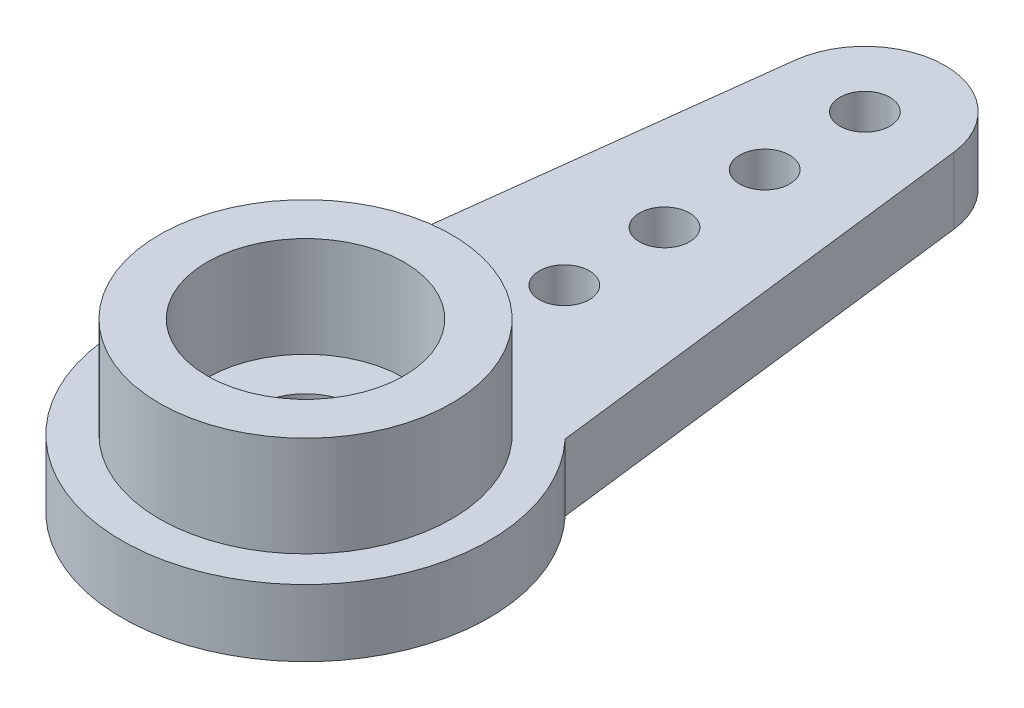
ISO-10303-21;
HEADER;
FILE_DESCRIPTION(('STEP AP214'),'2;1');
FILE_NAME('part.step','',(''),(''),'','','');
FILE_SCHEMA(('AUTOMOTIVE_DESIGN { 1 0 10303 214 1 1 1 1 }'));
ENDSEC;
DATA;
#1=APPLICATION_CONTEXT('core data for automotive mechanical design processes');
#2=APPLICATION_PROTOCOL_DEFINITION('international standard','automotive_design',2000,#1);
#3=PRODUCT_CONTEXT('',#1,'mechanical');
#4=PRODUCT('Part','Part','',(#3));
#5=PRODUCT_RELATED_PRODUCT_CATEGORY('part','',(#4));
#6=PRODUCT_DEFINITION_FORMATION('','',#4);
#7=PRODUCT_DEFINITION_CONTEXT('part definition',#1,'design');
#8=PRODUCT_DEFINITION('design','',#6,#7);
#9=PRODUCT_DEFINITION_SHAPE('','',#8);
#10=(LENGTH_UNIT() NAMED_UNIT(*) SI_UNIT(.MILLI.,.METRE.));
#11=(NAMED_UNIT(*) PLANE_ANGLE_UNIT() SI_UNIT($,.RADIAN.));
#12=(NAMED_UNIT(*) SI_UNIT($,.STERADIAN.) SOLID_ANGLE_UNIT());
#13=UNCERTAINTY_MEASURE_WITH_UNIT(LENGTH_MEASURE(1.E-05),#10,'distance_accuracy_value','');
#14=(GEOMETRIC_REPRESENTATION_CONTEXT(3) GLOBAL_UNCERTAINTY_ASSIGNED_CONTEXT((#13)) GLOBAL_UNIT_ASSIGNED_CONTEXT((#10,
#11,#12)) REPRESENTATION_CONTEXT('',''));
#15=CARTESIAN_POINT('',(0.,0.,0.));
#16=DIRECTION('',(0.,0.,1.));
#17=DIRECTION('',(1.,0.,0.));
#18=AXIS2_PLACEMENT_3D('',#15,#16,#17);
#19=CARTESIAN_POINT('',(0.,2.,-16.75));
#20=DIRECTION('',(0.,1.,0.));
#21=DIRECTION('',(0.,0.,1.));
#22=AXIS2_PLACEMENT_3D('',#19,#20,#21);
#23=PLANE('',#22);
#24=CARTESIAN_POINT('',(0.,2.,0.));
#25=DIRECTION('',(0.,1.,0.));
#26=DIRECTION('',(0.,0.,1.));
#27=AXIS2_PLACEMENT_3D('',#24,#25,#26);
#28=CIRCLE('',#27,1.5);
#29=CARTESIAN_POINT('',(0.,2.,1.5));
#30=VERTEX_POINT('',#29);
#31=EDGE_CURVE('E107',#30,#30,#28,.T.);
#32=ORIENTED_EDGE('',*,*,#31,.F.);
#33=EDGE_LOOP('',(#32));
#34=FACE_BOUND('',#33,.T.);
#35=CARTESIAN_POINT('',(0.,2.,0.));
#36=DIRECTION('',(0.,1.,0.));
#37=DIRECTION('',(0.,0.,1.));
#38=AXIS2_PLACEMENT_3D('',#35,#36,#37);
#39=CIRCLE('',#38,2.95);
#40=CARTESIAN_POINT('',(0.,2.,2.95));
#41=VERTEX_POINT('',#40);
#42=EDGE_CURVE('E11',#41,#41,#39,.F.);
#43=ORIENTED_EDGE('',*,*,#42,.F.);
#44=EDGE_LOOP('',(#43));
#45=FACE_BOUND('',#44,.T.);
#46=ADVANCED_FACE('F36',(#34,#45),#23,.T.);
#47=CARTESIAN_POINT('',(0.,2.,0.));
#48=DIRECTION('',(0.,1.,0.));
#49=DIRECTION('',(0.,0.,1.));
#50=AXIS2_PLACEMENT_3D('',#47,#48,#49);
#51=CIRCLE('',#50,4.375);
#52=CARTESIAN_POINT('',(0.,2.,4.375));
#53=VERTEX_POINT('',#52);
#54=EDGE_CURVE('E145',#53,#53,#51,.T.);
#55=ORIENTED_EDGE('',*,*,#54,.F.);
#56=EDGE_LOOP('',(#55));
#57=FACE_BOUND('',#56,.T.);
#58=CARTESIAN_POINT('',(0.,2.,-10.75));
#59=DIRECTION('',(0.,1.,0.));
#60=DIRECTION('',(0.,0.,1.));
#61=AXIS2_PLACEMENT_3D('',#58,#59,#60);
#62=CIRCLE('',#61,0.75);
#63=CARTESIAN_POINT('',(0.,2.,-10.));
#64=VERTEX_POINT('',#63);
#65=EDGE_CURVE('E149',#64,#64,#62,.T.);
#66=ORIENTED_EDGE('',*,*,#65,.F.);
#67=EDGE_LOOP('',(#66));
#68=FACE_BOUND('',#67,.T.);
#69=CARTESIAN_POINT('',(0.,2.,-16.75));
#70=DIRECTION('',(0.,1.,0.));
#71=DIRECTION('',(0.,0.,1.));
#72=AXIS2_PLACEMENT_3D('',#69,#70,#71);
#73=CIRCLE('',#72,0.75);
#74=CARTESIAN_POINT('',(0.,2.,-16.));
#75=VERTEX_POINT('',#74);
#76=EDGE_CURVE('E157',#75,#75,#73,.T.);
#77=ORIENTED_EDGE('',*,*,#76,.F.);
#78=EDGE_LOOP('',(#77));
#79=FACE_BOUND('',#78,.T.);
#80=CARTESIAN_POINT('',(0.,2.,-16.75));
#81=DIRECTION('',(0.,1.,0.));
#82=DIRECTION('',(0.,0.,1.));
#83=AXIS2_PLACEMENT_3D('',#80,#81,#82);
#84=CIRCLE('',#83,2.4);
#85=CARTESIAN_POINT('',(2.38235243289035,2.,-17.0405114206042));
#86=VERTEX_POINT('',#85);
#87=CARTESIAN_POINT('',(-2.38235243289035,2.,-17.0405114206042));
#88=VERTEX_POINT('',#87);
#89=EDGE_CURVE('E90',#86,#88,#84,.T.);
#90=ORIENTED_EDGE('',*,*,#89,.T.);
#91=DIRECTION('',(-0.121046425251735,0.,0.992646847037644));
#92=VECTOR('',#91,1.);
#93=CARTESIAN_POINT('',(-4.,2.,-3.77491721763537));
#94=LINE('',#93,#92);
#95=CARTESIAN_POINT('',(-4.,2.,-3.77491721763537));
#96=VERTEX_POINT('',#95);
#97=EDGE_CURVE('E84',#88,#96,#94,.T.);
#98=ORIENTED_EDGE('',*,*,#97,.T.);
#99=CARTESIAN_POINT('',(0.,2.,0.));
#100=DIRECTION('',(0.,1.,0.));
#101=DIRECTION('',(0.,0.,1.));
#102=AXIS2_PLACEMENT_3D('',#99,#100,#101);
#103=CIRCLE('',#102,5.5);
#104=CARTESIAN_POINT('',(4.,2.,-3.77491721763538));
#105=VERTEX_POINT('',#104);
#106=EDGE_CURVE('E88',#96,#105,#103,.T.);
#107=ORIENTED_EDGE('',*,*,#106,.T.);
#108=DIRECTION('',(-0.121046425251735,0.,-0.992646847037644));
#109=VECTOR('',#108,1.);
#110=CARTESIAN_POINT('',(4.,2.,-3.77491721763537));
#111=LINE('',#110,#109);
#112=EDGE_CURVE('E53',#105,#86,#111,.T.);
#113=ORIENTED_EDGE('',*,*,#112,.T.);
#114=EDGE_LOOP('',(#90,#98,#107,#113));
#115=FACE_BOUND('',#114,.T.);
#116=CARTESIAN_POINT('',(0.,2.,-13.75));
#117=DIRECTION('',(0.,1.,0.));
#118=DIRECTION('',(0.,0.,1.));
#119=AXIS2_PLACEMENT_3D('',#116,#117,#118);
#120=CIRCLE('',#119,0.75);
#121=CARTESIAN_POINT('',(0.,2.,-13.));
#122=VERTEX_POINT('',#121);
#123=EDGE_CURVE('E153',#122,#122,#120,.T.);
#124=ORIENTED_EDGE('',*,*,#123,.F.);
#125=EDGE_LOOP('',(#124));
#126=FACE_BOUND('',#125,.T.);
#127=CARTESIAN_POINT('',(0.,2.,-7.75));
#128=DIRECTION('',(0.,1.,0.));
#129=DIRECTION('',(0.,0.,1.));
#130=AXIS2_PLACEMENT_3D('',#127,#128,#129);
#131=CIRCLE('',#130,0.75);
#132=CARTESIAN_POINT('',(0.,2.,-7.));
#133=VERTEX_POINT('',#132);
#134=EDGE_CURVE('E139',#133,#133,#131,.T.);
#135=ORIENTED_EDGE('',*,*,#134,.F.);
#136=EDGE_LOOP('',(#135));
#137=FACE_BOUND('',#136,.T.);
#138=ADVANCED_FACE('F85',(#57,#68,#79,#115,#126,#137),#23,.T.);
#139=CARTESIAN_POINT('',(0.,0.,-16.75));
#140=DIRECTION('',(0.,1.,0.));
#141=DIRECTION('',(0.,0.,1.));
#142=AXIS2_PLACEMENT_3D('',#139,#140,#141);
#143=PLANE('',#142);
#144=CARTESIAN_POINT('',(0.,0.,-16.75));
#145=DIRECTION('',(0.,1.,0.));
#146=DIRECTION('',(0.,0.,1.));
#147=AXIS2_PLACEMENT_3D('',#144,#145,#146);
#148=CIRCLE('',#147,2.4);
#149=CARTESIAN_POINT('',(2.38235243289035,0.,-17.0405114206042));
#150=VERTEX_POINT('',#149);
#151=CARTESIAN_POINT('',(-2.38235243289035,0.,-17.0405114206042));
#152=VERTEX_POINT('',#151);
#153=EDGE_CURVE('E104',#150,#152,#148,.T.);
#154=ORIENTED_EDGE('',*,*,#153,.F.);
#155=DIRECTION('',(-0.121046425251735,0.,-0.992646847037644));
#156=VECTOR('',#155,1.);
#157=CARTESIAN_POINT('',(4.,0.,-3.77491721763537));
#158=LINE('',#157,#156);
#159=CARTESIAN_POINT('',(4.,0.,-3.77491721763538));
#160=VERTEX_POINT('',#159);
#161=EDGE_CURVE('E76',#160,#150,#158,.T.);
#162=ORIENTED_EDGE('',*,*,#161,.F.);
#163=CARTESIAN_POINT('',(0.,0.,0.));
#164=DIRECTION('',(0.,1.,0.));
#165=DIRECTION('',(0.,0.,1.));
#166=AXIS2_PLACEMENT_3D('',#163,#164,#165);
#167=CIRCLE('',#166,5.5);
#168=CARTESIAN_POINT('',(-4.,0.,-3.77491721763537));
#169=VERTEX_POINT('',#168);
#170=EDGE_CURVE('E70',#169,#160,#167,.T.);
#171=ORIENTED_EDGE('',*,*,#170,.F.);
#172=DIRECTION('',(-0.121046425251735,0.,0.992646847037644));
#173=VECTOR('',#172,1.);
#174=CARTESIAN_POINT('',(-4.,0.,-3.77491721763537));
#175=LINE('',#174,#173);
#176=EDGE_CURVE('E95',#152,#169,#175,.T.);
#177=ORIENTED_EDGE('',*,*,#176,.F.);
#178=EDGE_LOOP('',(#154,#162,#171,#177));
#179=FACE_BOUND('',#178,.T.);
#180=CARTESIAN_POINT('',(0.,0.,0.));
#181=DIRECTION('',(0.,1.,0.));
#182=DIRECTION('',(0.,0.,1.));
#183=AXIS2_PLACEMENT_3D('',#180,#181,#182);
#184=CIRCLE('',#183,1.5);
#185=CARTESIAN_POINT('',(0.,0.,1.5));
#186=VERTEX_POINT('',#185);
#187=EDGE_CURVE('E122',#186,#186,#184,.T.);
#188=ORIENTED_EDGE('',*,*,#187,.T.);
#189=EDGE_LOOP('',(#188));
#190=FACE_BOUND('',#189,.T.);
#191=CARTESIAN_POINT('',(0.,0.,-16.75));
#192=DIRECTION('',(0.,1.,0.));
#193=DIRECTION('',(0.,0.,1.));
#194=AXIS2_PLACEMENT_3D('',#191,#192,#193);
#195=CIRCLE('',#194,0.75);
#196=CARTESIAN_POINT('',(0.,0.,-16.));
#197=VERTEX_POINT('',#196);
#198=EDGE_CURVE('E126',#197,#197,#195,.T.);
#199=ORIENTED_EDGE('',*,*,#198,.T.);
#200=EDGE_LOOP('',(#199));
#201=FACE_BOUND('',#200,.T.);
#202=CARTESIAN_POINT('',(0.,0.,-13.75));
#203=DIRECTION('',(0.,1.,0.));
#204=DIRECTION('',(0.,0.,1.));
#205=AXIS2_PLACEMENT_3D('',#202,#203,#204);
#206=CIRCLE('',#205,0.75);
#207=CARTESIAN_POINT('',(0.,0.,-13.));
#208=VERTEX_POINT('',#207);
#209=EDGE_CURVE('E130',#208,#208,#206,.T.);
#210=ORIENTED_EDGE('',*,*,#209,.T.);
#211=EDGE_LOOP('',(#210));
#212=FACE_BOUND('',#211,.T.);
#213=CARTESIAN_POINT('',(0.,0.,-10.75));
#214=DIRECTION('',(0.,1.,0.));
#215=DIRECTION('',(0.,0.,1.));
#216=AXIS2_PLACEMENT_3D('',#213,#214,#215);
#217=CIRCLE('',#216,0.75);
#218=CARTESIAN_POINT('',(0.,0.,-10.));
#219=VERTEX_POINT('',#218);
#220=EDGE_CURVE('E134',#219,#219,#217,.T.);
#221=ORIENTED_EDGE('',*,*,#220,.T.);
#222=EDGE_LOOP('',(#221));
#223=FACE_BOUND('',#222,.T.);
#224=CARTESIAN_POINT('',(0.,0.,-7.75));
#225=DIRECTION('',(0.,1.,0.));
#226=DIRECTION('',(0.,0.,1.));
#227=AXIS2_PLACEMENT_3D('',#224,#225,#226);
#228=CIRCLE('',#227,0.75);
#229=CARTESIAN_POINT('',(0.,0.,-7.));
#230=VERTEX_POINT('',#229);
#231=EDGE_CURVE('E137',#230,#230,#228,.T.);
#232=ORIENTED_EDGE('',*,*,#231,.T.);
#233=EDGE_LOOP('',(#232));
#234=FACE_BOUND('',#233,.T.);
#235=ADVANCED_FACE('F115',(#179,#190,#201,#212,#223,#234),#143,.F.);
#236=CARTESIAN_POINT('',(0.,2.,-16.75));
#237=DIRECTION('',(0.,-1.,0.));
#238=DIRECTION('',(0.,0.,-1.));
#239=AXIS2_PLACEMENT_3D('',#236,#237,#238);
#240=CYLINDRICAL_SURFACE('',#239,2.4);
#241=ORIENTED_EDGE('',*,*,#153,.T.);
#242=DIRECTION('',(0.,-1.,0.));
#243=VECTOR('',#242,1.);
#244=CARTESIAN_POINT('',(-2.38235243289035,2.,-17.0405114206042));
#245=LINE('',#244,#243);
#246=EDGE_CURVE('E45',#88,#152,#245,.T.);
#247=ORIENTED_EDGE('',*,*,#246,.F.);
#248=ORIENTED_EDGE('',*,*,#89,.F.);
#249=DIRECTION('',(0.,-1.,0.));
#250=VECTOR('',#249,1.);
#251=CARTESIAN_POINT('',(2.38235243289035,2.,-17.0405114206042));
#252=LINE('',#251,#250);
#253=EDGE_CURVE('E100',#86,#150,#252,.T.);
#254=ORIENTED_EDGE('',*,*,#253,.T.);
#255=EDGE_LOOP('',(#241,#247,#248,#254));
#256=FACE_BOUND('',#255,.T.);
#257=ADVANCED_FACE('F38',(#256),#240,.T.);
#258=CARTESIAN_POINT('',(-4.,2.,-3.77491721763537));
#259=DIRECTION('',(0.992646847037644,0.,0.121046425251735));
#260=DIRECTION('',(0.121046425251735,0.,-0.992646847037644));
#261=AXIS2_PLACEMENT_3D('',#258,#259,#260);
#262=PLANE('',#261);
#263=ORIENTED_EDGE('',*,*,#176,.T.);
#264=DIRECTION('',(0.,-1.,0.));
#265=VECTOR('',#264,1.);
#266=CARTESIAN_POINT('',(-4.,2.,-3.77491721763537));
#267=LINE('',#266,#265);
#268=EDGE_CURVE('E93',#96,#169,#267,.T.);
#269=ORIENTED_EDGE('',*,*,#268,.F.);
#270=ORIENTED_EDGE('',*,*,#97,.F.);
#271=ORIENTED_EDGE('',*,*,#246,.T.);
#272=EDGE_LOOP('',(#263,#269,#270,#271));
#273=FACE_BOUND('',#272,.T.);
#274=ADVANCED_FACE('F94',(#273),#262,.F.);
#275=CARTESIAN_POINT('',(0.,2.,0.));
#276=DIRECTION('',(0.,-1.,0.));
#277=DIRECTION('',(0.,0.,-1.));
#278=AXIS2_PLACEMENT_3D('',#275,#276,#277);
#279=CYLINDRICAL_SURFACE('',#278,5.5);
#280=ORIENTED_EDGE('',*,*,#170,.T.);
#281=DIRECTION('',(0.,-1.,0.));
#282=VECTOR('',#281,1.);
#283=CARTESIAN_POINT('',(4.,2.,-3.77491721763538));
#284=LINE('',#283,#282);
#285=EDGE_CURVE('E96',#105,#160,#284,.T.);
#286=ORIENTED_EDGE('',*,*,#285,.F.);
#287=ORIENTED_EDGE('',*,*,#106,.F.);
#288=ORIENTED_EDGE('',*,*,#268,.T.);
#289=EDGE_LOOP('',(#280,#286,#287,#288));
#290=FACE_BOUND('',#289,.T.);
#291=ADVANCED_FACE('F98',(#290),#279,.T.);
#292=CARTESIAN_POINT('',(4.,2.,-3.77491721763537));
#293=DIRECTION('',(-0.992646847037644,0.,0.121046425251735));
#294=DIRECTION('',(0.121046425251735,0.,0.992646847037644));
#295=AXIS2_PLACEMENT_3D('',#292,#293,#294);
#296=PLANE('',#295);
#297=ORIENTED_EDGE('',*,*,#161,.T.);
#298=ORIENTED_EDGE('',*,*,#253,.F.);
#299=ORIENTED_EDGE('',*,*,#112,.F.);
#300=ORIENTED_EDGE('',*,*,#285,.T.);
#301=EDGE_LOOP('',(#297,#298,#299,#300));
#302=FACE_BOUND('',#301,.T.);
#303=ADVANCED_FACE('F206',(#302),#296,.F.);
#304=CARTESIAN_POINT('',(0.,2.,0.));
#305=DIRECTION('',(0.,-1.,0.));
#306=DIRECTION('',(0.,0.,-1.));
#307=AXIS2_PLACEMENT_3D('',#304,#305,#306);
#308=CYLINDRICAL_SURFACE('',#307,1.5);
#309=ORIENTED_EDGE('',*,*,#31,.T.);
#310=EDGE_LOOP('',(#309));
#311=FACE_BOUND('',#310,.T.);
#312=ORIENTED_EDGE('',*,*,#187,.F.);
#313=EDGE_LOOP('',(#312));
#314=FACE_BOUND('',#313,.T.);
#315=ADVANCED_FACE('F165',(#311,#314),#308,.F.);
#316=CARTESIAN_POINT('',(0.,2.,-16.75));
#317=DIRECTION('',(0.,-1.,0.));
#318=DIRECTION('',(0.,0.,-1.));
#319=AXIS2_PLACEMENT_3D('',#316,#317,#318);
#320=CYLINDRICAL_SURFACE('',#319,0.75);
#321=ORIENTED_EDGE('',*,*,#76,.T.);
#322=EDGE_LOOP('',(#321));
#323=FACE_BOUND('',#322,.T.);
#324=ORIENTED_EDGE('',*,*,#198,.F.);
#325=EDGE_LOOP('',(#324));
#326=FACE_BOUND('',#325,.T.);
#327=ADVANCED_FACE('F200',(#323,#326),#320,.F.);
#328=CARTESIAN_POINT('',(0.,2.,-13.75));
#329=DIRECTION('',(0.,-1.,0.));
#330=DIRECTION('',(0.,0.,-1.));
#331=AXIS2_PLACEMENT_3D('',#328,#329,#330);
#332=CYLINDRICAL_SURFACE('',#331,0.75);
#333=ORIENTED_EDGE('',*,*,#123,.T.);
#334=EDGE_LOOP('',(#333));
#335=FACE_BOUND('',#334,.T.);
#336=ORIENTED_EDGE('',*,*,#209,.F.);
#337=EDGE_LOOP('',(#336));
#338=FACE_BOUND('',#337,.T.);
#339=ADVANCED_FACE('F196',(#335,#338),#332,.F.);
#340=CARTESIAN_POINT('',(0.,2.,-10.75));
#341=DIRECTION('',(0.,-1.,0.));
#342=DIRECTION('',(0.,0.,-1.));
#343=AXIS2_PLACEMENT_3D('',#340,#341,#342);
#344=CYLINDRICAL_SURFACE('',#343,0.75);
#345=ORIENTED_EDGE('',*,*,#65,.T.);
#346=EDGE_LOOP('',(#345));
#347=FACE_BOUND('',#346,.T.);
#348=ORIENTED_EDGE('',*,*,#220,.F.);
#349=EDGE_LOOP('',(#348));
#350=FACE_BOUND('',#349,.T.);
#351=ADVANCED_FACE('F192',(#347,#350),#344,.F.);
#352=CARTESIAN_POINT('',(0.,2.,-7.75));
#353=DIRECTION('',(0.,-1.,0.));
#354=DIRECTION('',(0.,0.,-1.));
#355=AXIS2_PLACEMENT_3D('',#352,#353,#354);
#356=CYLINDRICAL_SURFACE('',#355,0.75);
#357=ORIENTED_EDGE('',*,*,#134,.T.);
#358=EDGE_LOOP('',(#357));
#359=FACE_BOUND('',#358,.T.);
#360=ORIENTED_EDGE('',*,*,#231,.F.);
#361=EDGE_LOOP('',(#360));
#362=FACE_BOUND('',#361,.T.);
#363=ADVANCED_FACE('F187',(#359,#362),#356,.F.);
#364=CARTESIAN_POINT('',(0.,5.,0.));
#365=DIRECTION('',(0.,1.,0.));
#366=DIRECTION('',(0.,0.,1.));
#367=AXIS2_PLACEMENT_3D('',#364,#365,#366);
#368=PLANE('',#367);
#369=CARTESIAN_POINT('',(0.,5.,0.));
#370=DIRECTION('',(0.,1.,0.));
#371=DIRECTION('',(0.,0.,1.));
#372=AXIS2_PLACEMENT_3D('',#369,#370,#371);
#373=CIRCLE('',#372,4.375);
#374=CARTESIAN_POINT('',(0.,5.,4.375));
#375=VERTEX_POINT('',#374);
#376=EDGE_CURVE('E140',#375,#375,#373,.T.);
#377=ORIENTED_EDGE('',*,*,#376,.T.);
#378=EDGE_LOOP('',(#377));
#379=FACE_BOUND('',#378,.T.);
#380=CARTESIAN_POINT('',(0.,5.,0.));
#381=DIRECTION('',(0.,1.,0.));
#382=DIRECTION('',(0.,0.,1.));
#383=AXIS2_PLACEMENT_3D('',#380,#381,#382);
#384=CIRCLE('',#383,2.95);
#385=CARTESIAN_POINT('',(0.,5.,2.95));
#386=VERTEX_POINT('',#385);
#387=EDGE_CURVE('E321',#386,#386,#384,.T.);
#388=ORIENTED_EDGE('',*,*,#387,.F.);
#389=EDGE_LOOP('',(#388));
#390=FACE_BOUND('',#389,.T.);
#391=ADVANCED_FACE('F181',(#379,#390),#368,.T.);
#392=CARTESIAN_POINT('',(0.,5.,0.));
#393=DIRECTION('',(0.,-1.,0.));
#394=DIRECTION('',(0.,0.,-1.));
#395=AXIS2_PLACEMENT_3D('',#392,#393,#394);
#396=CYLINDRICAL_SURFACE('',#395,4.375);
#397=ORIENTED_EDGE('',*,*,#376,.F.);
#398=EDGE_LOOP('',(#397));
#399=FACE_BOUND('',#398,.T.);
#400=ORIENTED_EDGE('',*,*,#54,.T.);
#401=EDGE_LOOP('',(#400));
#402=FACE_BOUND('',#401,.T.);
#403=ADVANCED_FACE('F175',(#399,#402),#396,.T.);
#404=CARTESIAN_POINT('',(0.,5.,0.));
#405=DIRECTION('',(0.,-1.,0.));
#406=DIRECTION('',(0.,0.,-1.));
#407=AXIS2_PLACEMENT_3D('',#404,#405,#406);
#408=CYLINDRICAL_SURFACE('',#407,2.95);
#409=ORIENTED_EDGE('',*,*,#387,.T.);
#410=EDGE_LOOP('',(#409));
#411=FACE_BOUND('',#410,.T.);
#412=ORIENTED_EDGE('',*,*,#42,.T.);
#413=EDGE_LOOP('',(#412));
#414=FACE_BOUND('',#413,.T.);
#415=ADVANCED_FACE('F173',(#411,#414),#408,.F.);
#416=CLOSED_SHELL('',(#46,#138,#235,#257,#274,#291,#303,#315,#327,#339,#351,#363,#391,#403,#415));
#417=MANIFOLD_SOLID_BREP('B2',#416);
#418=ADVANCED_BREP_SHAPE_REPRESENTATION('',(#18,#417),#14);
#419=SHAPE_DEFINITION_REPRESENTATION(#9,#418);
ENDSEC;
END-ISO-10303-21;
